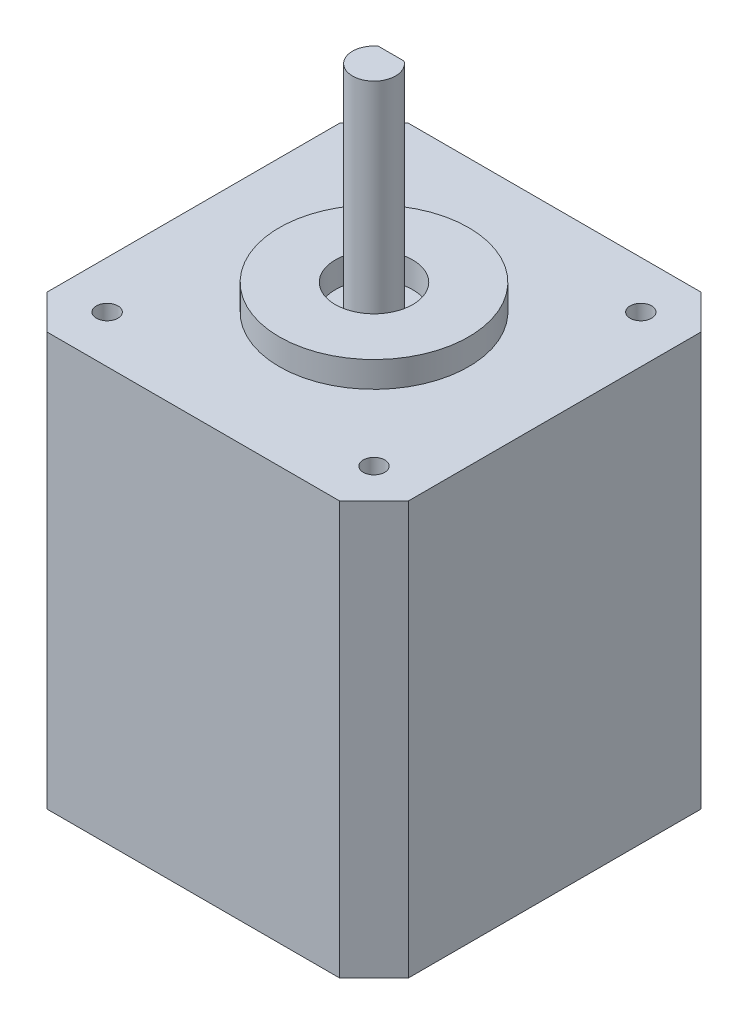
ISO-10303-21;
HEADER;
FILE_DESCRIPTION(('STEP AP214'),'2;1');
FILE_NAME('part.step','',(''),(''),'','','');
FILE_SCHEMA(('AUTOMOTIVE_DESIGN { 1 0 10303 214 1 1 1 1 }'));
ENDSEC;
DATA;
#1=APPLICATION_CONTEXT('core data for automotive mechanical design processes');
#2=APPLICATION_PROTOCOL_DEFINITION('international standard','automotive_design',2000,#1);
#3=PRODUCT_CONTEXT('',#1,'mechanical');
#4=PRODUCT('Part','Part','',(#3));
#5=PRODUCT_RELATED_PRODUCT_CATEGORY('part','',(#4));
#6=PRODUCT_DEFINITION_FORMATION('','',#4);
#7=PRODUCT_DEFINITION_CONTEXT('part definition',#1,'design');
#8=PRODUCT_DEFINITION('design','',#6,#7);
#9=PRODUCT_DEFINITION_SHAPE('','',#8);
#10=(LENGTH_UNIT() NAMED_UNIT(*) SI_UNIT(.MILLI.,.METRE.));
#11=(NAMED_UNIT(*) PLANE_ANGLE_UNIT() SI_UNIT($,.RADIAN.));
#12=(NAMED_UNIT(*) SI_UNIT($,.STERADIAN.) SOLID_ANGLE_UNIT());
#13=UNCERTAINTY_MEASURE_WITH_UNIT(LENGTH_MEASURE(1.E-05),#10,'distance_accuracy_value','');
#14=(GEOMETRIC_REPRESENTATION_CONTEXT(3) GLOBAL_UNCERTAINTY_ASSIGNED_CONTEXT((#13)) GLOBAL_UNIT_ASSIGNED_CONTEXT((#10,
#11,#12)) REPRESENTATION_CONTEXT('',''));
#15=CARTESIAN_POINT('',(0.,0.,0.));
#16=DIRECTION('',(0.,0.,1.));
#17=DIRECTION('',(1.,0.,0.));
#18=AXIS2_PLACEMENT_3D('',#15,#16,#17);
#19=CARTESIAN_POINT('',(0.,48.,0.));
#20=DIRECTION('',(0.,1.,0.));
#21=DIRECTION('',(0.,0.,1.));
#22=AXIS2_PLACEMENT_3D('',#19,#20,#21);
#23=PLANE('',#22);
#24=CARTESIAN_POINT('',(0.,48.,0.));
#25=DIRECTION('',(0.,1.,0.));
#26=DIRECTION('',(0.,0.,1.));
#27=AXIS2_PLACEMENT_3D('',#24,#25,#26);
#28=CIRCLE('',#27,4.5);
#29=CARTESIAN_POINT('',(0.,48.,4.5));
#30=VERTEX_POINT('',#29);
#31=EDGE_CURVE('E194',#30,#30,#28,.F.);
#32=ORIENTED_EDGE('',*,*,#31,.F.);
#33=EDGE_LOOP('',(#32));
#34=FACE_BOUND('',#33,.T.);
#35=DIRECTION('',(-1.,0.,0.));
#36=VECTOR('',#35,1.);
#37=CARTESIAN_POINT('',(1.5,48.,-2.));
#38=LINE('',#37,#36);
#39=CARTESIAN_POINT('',(1.5,48.,-2.));
#40=VERTEX_POINT('',#39);
#41=CARTESIAN_POINT('',(-1.5,48.,-2.));
#42=VERTEX_POINT('',#41);
#43=EDGE_CURVE('E163',#40,#42,#38,.T.);
#44=ORIENTED_EDGE('',*,*,#43,.F.);
#45=CARTESIAN_POINT('',(0.,48.,0.));
#46=DIRECTION('',(0.,1.,0.));
#47=DIRECTION('',(0.,0.,1.));
#48=AXIS2_PLACEMENT_3D('',#45,#46,#47);
#49=CIRCLE('',#48,2.5);
#50=EDGE_CURVE('E158',#42,#40,#49,.T.);
#51=ORIENTED_EDGE('',*,*,#50,.F.);
#52=EDGE_LOOP('',(#44,#51));
#53=FACE_BOUND('',#52,.T.);
#54=ADVANCED_FACE('F37',(#34,#53),#23,.T.);
#55=CARTESIAN_POINT('',(-21.,48.,21.));
#56=DIRECTION('',(1.,0.,0.));
#57=DIRECTION('',(0.,0.,-1.));
#58=AXIS2_PLACEMENT_3D('',#55,#56,#57);
#59=PLANE('',#58);
#60=DIRECTION('',(0.,0.,1.));
#61=VECTOR('',#60,1.);
#62=CARTESIAN_POINT('',(-21.,0.,21.));
#63=LINE('',#62,#61);
#64=CARTESIAN_POINT('',(-21.,0.,-17.));
#65=VERTEX_POINT('',#64);
#66=CARTESIAN_POINT('',(-21.,0.,17.));
#67=VERTEX_POINT('',#66);
#68=EDGE_CURVE('E180',#65,#67,#63,.T.);
#69=ORIENTED_EDGE('',*,*,#68,.T.);
#70=DIRECTION('',(0.,1.,0.));
#71=VECTOR('',#70,1.);
#72=CARTESIAN_POINT('',(-21.,48.,17.));
#73=LINE('',#72,#71);
#74=CARTESIAN_POINT('',(-21.,48.,17.));
#75=VERTEX_POINT('',#74);
#76=EDGE_CURVE('E11',#67,#75,#73,.T.);
#77=ORIENTED_EDGE('',*,*,#76,.T.);
#78=DIRECTION('',(0.,0.,1.));
#79=VECTOR('',#78,1.);
#80=CARTESIAN_POINT('',(-21.,48.,21.));
#81=LINE('',#80,#79);
#82=CARTESIAN_POINT('',(-21.,48.,-17.));
#83=VERTEX_POINT('',#82);
#84=EDGE_CURVE('E183',#83,#75,#81,.T.);
#85=ORIENTED_EDGE('',*,*,#84,.F.);
#86=DIRECTION('',(0.,-1.,0.));
#87=VECTOR('',#86,1.);
#88=CARTESIAN_POINT('',(-21.,48.,-17.));
#89=LINE('',#88,#87);
#90=EDGE_CURVE('E45',#83,#65,#89,.T.);
#91=ORIENTED_EDGE('',*,*,#90,.T.);
#92=EDGE_LOOP('',(#69,#77,#85,#91));
#93=FACE_BOUND('',#92,.T.);
#94=ADVANCED_FACE('F239',(#93),#59,.F.);
#95=CARTESIAN_POINT('',(21.,48.,21.));
#96=DIRECTION('',(0.,0.,-1.));
#97=DIRECTION('',(-1.,0.,0.));
#98=AXIS2_PLACEMENT_3D('',#95,#96,#97);
#99=PLANE('',#98);
#100=DIRECTION('',(1.,0.,0.));
#101=VECTOR('',#100,1.);
#102=CARTESIAN_POINT('',(21.,0.,21.));
#103=LINE('',#102,#101);
#104=CARTESIAN_POINT('',(-17.,0.,21.));
#105=VERTEX_POINT('',#104);
#106=CARTESIAN_POINT('',(17.,0.,21.));
#107=VERTEX_POINT('',#106);
#108=EDGE_CURVE('E197',#105,#107,#103,.T.);
#109=ORIENTED_EDGE('',*,*,#108,.T.);
#110=DIRECTION('',(0.,1.,0.));
#111=VECTOR('',#110,1.);
#112=CARTESIAN_POINT('',(17.,48.,21.));
#113=LINE('',#112,#111);
#114=CARTESIAN_POINT('',(17.,48.,21.));
#115=VERTEX_POINT('',#114);
#116=EDGE_CURVE('E52',#107,#115,#113,.T.);
#117=ORIENTED_EDGE('',*,*,#116,.T.);
#118=DIRECTION('',(1.,0.,0.));
#119=VECTOR('',#118,1.);
#120=CARTESIAN_POINT('',(21.,48.,21.));
#121=LINE('',#120,#119);
#122=CARTESIAN_POINT('',(-17.,48.,21.));
#123=VERTEX_POINT('',#122);
#124=EDGE_CURVE('E185',#123,#115,#121,.T.);
#125=ORIENTED_EDGE('',*,*,#124,.F.);
#126=DIRECTION('',(0.,-1.,0.));
#127=VECTOR('',#126,1.);
#128=CARTESIAN_POINT('',(-17.,48.,21.));
#129=LINE('',#128,#127);
#130=EDGE_CURVE('E231',#123,#105,#129,.T.);
#131=ORIENTED_EDGE('',*,*,#130,.T.);
#132=EDGE_LOOP('',(#109,#117,#125,#131));
#133=FACE_BOUND('',#132,.T.);
#134=ADVANCED_FACE('F250',(#133),#99,.F.);
#135=CARTESIAN_POINT('',(21.,48.,21.));
#136=DIRECTION('',(-1.,0.,0.));
#137=DIRECTION('',(0.,0.,1.));
#138=AXIS2_PLACEMENT_3D('',#135,#136,#137);
#139=PLANE('',#138);
#140=DIRECTION('',(0.,0.,-1.));
#141=VECTOR('',#140,1.);
#142=CARTESIAN_POINT('',(21.,0.,21.));
#143=LINE('',#142,#141);
#144=CARTESIAN_POINT('',(21.,0.,17.));
#145=VERTEX_POINT('',#144);
#146=CARTESIAN_POINT('',(21.,0.,-17.));
#147=VERTEX_POINT('',#146);
#148=EDGE_CURVE('E199',#145,#147,#143,.T.);
#149=ORIENTED_EDGE('',*,*,#148,.T.);
#150=DIRECTION('',(0.,1.,0.));
#151=VECTOR('',#150,1.);
#152=CARTESIAN_POINT('',(21.,48.,-17.));
#153=LINE('',#152,#151);
#154=CARTESIAN_POINT('',(21.,48.,-17.));
#155=VERTEX_POINT('',#154);
#156=EDGE_CURVE('E222',#147,#155,#153,.T.);
#157=ORIENTED_EDGE('',*,*,#156,.T.);
#158=DIRECTION('',(0.,0.,-1.));
#159=VECTOR('',#158,1.);
#160=CARTESIAN_POINT('',(21.,48.,21.));
#161=LINE('',#160,#159);
#162=CARTESIAN_POINT('',(21.,48.,17.));
#163=VERTEX_POINT('',#162);
#164=EDGE_CURVE('E188',#163,#155,#161,.T.);
#165=ORIENTED_EDGE('',*,*,#164,.F.);
#166=DIRECTION('',(0.,-1.,0.));
#167=VECTOR('',#166,1.);
#168=CARTESIAN_POINT('',(21.,48.,17.));
#169=LINE('',#168,#167);
#170=EDGE_CURVE('E219',#163,#145,#169,.T.);
#171=ORIENTED_EDGE('',*,*,#170,.T.);
#172=EDGE_LOOP('',(#149,#157,#165,#171));
#173=FACE_BOUND('',#172,.T.);
#174=ADVANCED_FACE('F259',(#173),#139,.F.);
#175=CARTESIAN_POINT('',(21.,48.,-21.));
#176=DIRECTION('',(0.,0.,1.));
#177=DIRECTION('',(1.,0.,0.));
#178=AXIS2_PLACEMENT_3D('',#175,#176,#177);
#179=PLANE('',#178);
#180=DIRECTION('',(-1.,0.,0.));
#181=VECTOR('',#180,1.);
#182=CARTESIAN_POINT('',(21.,48.,-21.));
#183=LINE('',#182,#181);
#184=CARTESIAN_POINT('',(17.,48.,-21.));
#185=VERTEX_POINT('',#184);
#186=CARTESIAN_POINT('',(-17.,48.,-21.));
#187=VERTEX_POINT('',#186);
#188=EDGE_CURVE('E191',#185,#187,#183,.T.);
#189=ORIENTED_EDGE('',*,*,#188,.F.);
#190=DIRECTION('',(0.,-1.,0.));
#191=VECTOR('',#190,1.);
#192=CARTESIAN_POINT('',(17.,48.,-21.));
#193=LINE('',#192,#191);
#194=CARTESIAN_POINT('',(17.,0.,-21.));
#195=VERTEX_POINT('',#194);
#196=EDGE_CURVE('E208',#185,#195,#193,.T.);
#197=ORIENTED_EDGE('',*,*,#196,.T.);
#198=DIRECTION('',(-1.,0.,0.));
#199=VECTOR('',#198,1.);
#200=CARTESIAN_POINT('',(21.,0.,-21.));
#201=LINE('',#200,#199);
#202=CARTESIAN_POINT('',(-17.,0.,-21.));
#203=VERTEX_POINT('',#202);
#204=EDGE_CURVE('E186',#195,#203,#201,.T.);
#205=ORIENTED_EDGE('',*,*,#204,.T.);
#206=DIRECTION('',(0.,1.,0.));
#207=VECTOR('',#206,1.);
#208=CARTESIAN_POINT('',(-17.,48.,-21.));
#209=LINE('',#208,#207);
#210=EDGE_CURVE('E206',#203,#187,#209,.T.);
#211=ORIENTED_EDGE('',*,*,#210,.T.);
#212=EDGE_LOOP('',(#189,#197,#205,#211));
#213=FACE_BOUND('',#212,.T.);
#214=ADVANCED_FACE('F267',(#213),#179,.F.);
#215=CARTESIAN_POINT('',(-15.5,48.,-15.5));
#216=DIRECTION('',(0.,1.,0.));
#217=DIRECTION('',(0.,0.,1.));
#218=AXIS2_PLACEMENT_3D('',#215,#216,#217);
#219=CIRCLE('',#218,1.24999999999999);
#220=CARTESIAN_POINT('',(-15.5,48.,-14.25));
#221=VERTEX_POINT('',#220);
#222=EDGE_CURVE('E136',#221,#221,#219,.T.);
#223=ORIENTED_EDGE('',*,*,#222,.F.);
#224=EDGE_LOOP('',(#223));
#225=FACE_BOUND('',#224,.T.);
#226=CARTESIAN_POINT('',(-15.5,48.,15.5));
#227=DIRECTION('',(0.,1.,0.));
#228=DIRECTION('',(0.,0.,1.));
#229=AXIS2_PLACEMENT_3D('',#226,#227,#228);
#230=CIRCLE('',#229,1.24999999999999);
#231=CARTESIAN_POINT('',(-15.5,48.,16.75));
#232=VERTEX_POINT('',#231);
#233=EDGE_CURVE('E135',#232,#232,#230,.T.);
#234=ORIENTED_EDGE('',*,*,#233,.F.);
#235=EDGE_LOOP('',(#234));
#236=FACE_BOUND('',#235,.T.);
#237=CARTESIAN_POINT('',(15.5,48.,15.5));
#238=DIRECTION('',(0.,1.,0.));
#239=DIRECTION('',(0.,0.,1.));
#240=AXIS2_PLACEMENT_3D('',#237,#238,#239);
#241=CIRCLE('',#240,1.24999999999999);
#242=CARTESIAN_POINT('',(15.5,48.,16.75));
#243=VERTEX_POINT('',#242);
#244=EDGE_CURVE('E146',#243,#243,#241,.T.);
#245=ORIENTED_EDGE('',*,*,#244,.F.);
#246=EDGE_LOOP('',(#245));
#247=FACE_BOUND('',#246,.T.);
#248=CARTESIAN_POINT('',(15.5,48.,-15.5));
#249=DIRECTION('',(0.,1.,0.));
#250=DIRECTION('',(0.,0.,1.));
#251=AXIS2_PLACEMENT_3D('',#248,#249,#250);
#252=CIRCLE('',#251,1.24999999999999);
#253=CARTESIAN_POINT('',(15.5,48.,-14.25));
#254=VERTEX_POINT('',#253);
#255=EDGE_CURVE('E152',#254,#254,#252,.T.);
#256=ORIENTED_EDGE('',*,*,#255,.F.);
#257=EDGE_LOOP('',(#256));
#258=FACE_BOUND('',#257,.T.);
#259=CARTESIAN_POINT('',(0.,48.,0.));
#260=DIRECTION('',(0.,1.,0.));
#261=DIRECTION('',(0.,0.,1.));
#262=AXIS2_PLACEMENT_3D('',#259,#260,#261);
#263=CIRCLE('',#262,11.);
#264=CARTESIAN_POINT('',(0.,48.,11.));
#265=VERTEX_POINT('',#264);
#266=EDGE_CURVE('E176',#265,#265,#263,.T.);
#267=ORIENTED_EDGE('',*,*,#266,.F.);
#268=EDGE_LOOP('',(#267));
#269=FACE_BOUND('',#268,.T.);
#270=ORIENTED_EDGE('',*,*,#164,.T.);
#271=DIRECTION('',(0.707106781186547,0.,0.707106781186548));
#272=VECTOR('',#271,1.);
#273=CARTESIAN_POINT('',(19.,48.,-19.));
#274=LINE('',#273,#272);
#275=EDGE_CURVE('E229',#155,#185,#274,.F.);
#276=ORIENTED_EDGE('',*,*,#275,.T.);
#277=ORIENTED_EDGE('',*,*,#188,.T.);
#278=DIRECTION('',(0.707106781186548,0.,-0.707106781186547));
#279=VECTOR('',#278,1.);
#280=CARTESIAN_POINT('',(-19.,48.,-19.));
#281=LINE('',#280,#279);
#282=EDGE_CURVE('E224',#187,#83,#281,.F.);
#283=ORIENTED_EDGE('',*,*,#282,.T.);
#284=ORIENTED_EDGE('',*,*,#84,.T.);
#285=DIRECTION('',(-0.707106781186545,0.,-0.70710678118655));
#286=VECTOR('',#285,1.);
#287=CARTESIAN_POINT('',(-19.0000000000001,48.,18.9999999999999));
#288=LINE('',#287,#286);
#289=EDGE_CURVE('E59',#75,#123,#288,.F.);
#290=ORIENTED_EDGE('',*,*,#289,.T.);
#291=ORIENTED_EDGE('',*,*,#124,.T.);
#292=DIRECTION('',(-0.707106781186548,0.,0.707106781186548));
#293=VECTOR('',#292,1.);
#294=CARTESIAN_POINT('',(19.,48.,19.));
#295=LINE('',#294,#293);
#296=EDGE_CURVE('E227',#115,#163,#295,.F.);
#297=ORIENTED_EDGE('',*,*,#296,.T.);
#298=EDGE_LOOP('',(#270,#276,#277,#283,#284,#290,#291,#297));
#299=FACE_BOUND('',#298,.T.);
#300=ADVANCED_FACE('F252',(#225,#236,#247,#258,#269,#299),#23,.T.);
#301=CARTESIAN_POINT('',(0.,0.,0.));
#302=DIRECTION('',(0.,1.,0.));
#303=DIRECTION('',(0.,0.,1.));
#304=AXIS2_PLACEMENT_3D('',#301,#302,#303);
#305=PLANE('',#304);
#306=ORIENTED_EDGE('',*,*,#204,.F.);
#307=DIRECTION('',(-0.707106781186547,0.,-0.707106781186548));
#308=VECTOR('',#307,1.);
#309=CARTESIAN_POINT('',(17.,0.,-21.));
#310=LINE('',#309,#308);
#311=EDGE_CURVE('E217',#195,#147,#310,.F.);
#312=ORIENTED_EDGE('',*,*,#311,.T.);
#313=ORIENTED_EDGE('',*,*,#148,.F.);
#314=DIRECTION('',(0.707106781186548,0.,-0.707106781186548));
#315=VECTOR('',#314,1.);
#316=CARTESIAN_POINT('',(21.,0.,17.));
#317=LINE('',#316,#315);
#318=EDGE_CURVE('E215',#145,#107,#317,.F.);
#319=ORIENTED_EDGE('',*,*,#318,.T.);
#320=ORIENTED_EDGE('',*,*,#108,.F.);
#321=DIRECTION('',(0.707106781186545,0.,0.70710678118655));
#322=VECTOR('',#321,1.);
#323=CARTESIAN_POINT('',(-17.,0.,21.));
#324=LINE('',#323,#322);
#325=EDGE_CURVE('E213',#105,#67,#324,.F.);
#326=ORIENTED_EDGE('',*,*,#325,.T.);
#327=ORIENTED_EDGE('',*,*,#68,.F.);
#328=DIRECTION('',(-0.707106781186548,0.,0.707106781186547));
#329=VECTOR('',#328,1.);
#330=CARTESIAN_POINT('',(-21.,0.,-17.));
#331=LINE('',#330,#329);
#332=EDGE_CURVE('E211',#65,#203,#331,.F.);
#333=ORIENTED_EDGE('',*,*,#332,.T.);
#334=EDGE_LOOP('',(#306,#312,#313,#319,#320,#326,#327,#333));
#335=FACE_BOUND('',#334,.T.);
#336=ADVANCED_FACE('F245',(#335),#305,.F.);
#337=CARTESIAN_POINT('',(0.,51.,0.));
#338=DIRECTION('',(0.,1.,0.));
#339=DIRECTION('',(0.,0.,1.));
#340=AXIS2_PLACEMENT_3D('',#337,#338,#339);
#341=PLANE('',#340);
#342=CARTESIAN_POINT('',(0.,51.,0.));
#343=DIRECTION('',(0.,1.,0.));
#344=DIRECTION('',(0.,0.,1.));
#345=AXIS2_PLACEMENT_3D('',#342,#343,#344);
#346=CIRCLE('',#345,11.);
#347=CARTESIAN_POINT('',(0.,51.,11.));
#348=VERTEX_POINT('',#347);
#349=EDGE_CURVE('E177',#348,#348,#346,.T.);
#350=ORIENTED_EDGE('',*,*,#349,.T.);
#351=EDGE_LOOP('',(#350));
#352=FACE_BOUND('',#351,.T.);
#353=CARTESIAN_POINT('',(0.,51.,0.));
#354=DIRECTION('',(0.,1.,0.));
#355=DIRECTION('',(0.,0.,1.));
#356=AXIS2_PLACEMENT_3D('',#353,#354,#355);
#357=CIRCLE('',#356,4.5);
#358=CARTESIAN_POINT('',(0.,51.,4.5));
#359=VERTEX_POINT('',#358);
#360=EDGE_CURVE('E173',#359,#359,#357,.T.);
#361=ORIENTED_EDGE('',*,*,#360,.F.);
#362=EDGE_LOOP('',(#361));
#363=FACE_BOUND('',#362,.T.);
#364=ADVANCED_FACE('F290',(#352,#363),#341,.T.);
#365=CARTESIAN_POINT('',(0.,51.,0.));
#366=DIRECTION('',(0.,-1.,0.));
#367=DIRECTION('',(0.,0.,-1.));
#368=AXIS2_PLACEMENT_3D('',#365,#366,#367);
#369=CYLINDRICAL_SURFACE('',#368,11.);
#370=ORIENTED_EDGE('',*,*,#349,.F.);
#371=EDGE_LOOP('',(#370));
#372=FACE_BOUND('',#371,.T.);
#373=ORIENTED_EDGE('',*,*,#266,.T.);
#374=EDGE_LOOP('',(#373));
#375=FACE_BOUND('',#374,.T.);
#376=ADVANCED_FACE('F302',(#372,#375),#369,.T.);
#377=CARTESIAN_POINT('',(0.,51.,0.));
#378=DIRECTION('',(0.,-1.,0.));
#379=DIRECTION('',(0.,0.,-1.));
#380=AXIS2_PLACEMENT_3D('',#377,#378,#379);
#381=CYLINDRICAL_SURFACE('',#380,4.5);
#382=ORIENTED_EDGE('',*,*,#360,.T.);
#383=EDGE_LOOP('',(#382));
#384=FACE_BOUND('',#383,.T.);
#385=ORIENTED_EDGE('',*,*,#31,.T.);
#386=EDGE_LOOP('',(#385));
#387=FACE_BOUND('',#386,.T.);
#388=ADVANCED_FACE('F304',(#384,#387),#381,.F.);
#389=CARTESIAN_POINT('',(0.,73.,0.));
#390=DIRECTION('',(0.,-1.,0.));
#391=DIRECTION('',(0.,0.,-1.));
#392=AXIS2_PLACEMENT_3D('',#389,#390,#391);
#393=CYLINDRICAL_SURFACE('',#392,2.5);
#394=ORIENTED_EDGE('',*,*,#50,.T.);
#395=DIRECTION('',(0.,-1.,0.));
#396=VECTOR('',#395,1.);
#397=CARTESIAN_POINT('',(1.5,73.,-2.));
#398=LINE('',#397,#396);
#399=CARTESIAN_POINT('',(1.5,73.,-2.));
#400=VERTEX_POINT('',#399);
#401=EDGE_CURVE('E170',#400,#40,#398,.T.);
#402=ORIENTED_EDGE('',*,*,#401,.F.);
#403=CARTESIAN_POINT('',(0.,73.,0.));
#404=DIRECTION('',(0.,1.,0.));
#405=DIRECTION('',(0.,0.,1.));
#406=AXIS2_PLACEMENT_3D('',#403,#404,#405);
#407=CIRCLE('',#406,2.5);
#408=CARTESIAN_POINT('',(-1.5,73.,-2.));
#409=VERTEX_POINT('',#408);
#410=EDGE_CURVE('E159',#409,#400,#407,.T.);
#411=ORIENTED_EDGE('',*,*,#410,.F.);
#412=DIRECTION('',(0.,-1.,0.));
#413=VECTOR('',#412,1.);
#414=CARTESIAN_POINT('',(-1.5,73.,-2.));
#415=LINE('',#414,#413);
#416=EDGE_CURVE('E165',#409,#42,#415,.T.);
#417=ORIENTED_EDGE('',*,*,#416,.T.);
#418=EDGE_LOOP('',(#394,#402,#411,#417));
#419=FACE_BOUND('',#418,.T.);
#420=ADVANCED_FACE('F310',(#419),#393,.T.);
#421=CARTESIAN_POINT('',(1.5,73.,-2.));
#422=DIRECTION('',(0.,0.,1.));
#423=DIRECTION('',(1.,0.,0.));
#424=AXIS2_PLACEMENT_3D('',#421,#422,#423);
#425=PLANE('',#424);
#426=ORIENTED_EDGE('',*,*,#43,.T.);
#427=ORIENTED_EDGE('',*,*,#416,.F.);
#428=DIRECTION('',(-1.,0.,0.));
#429=VECTOR('',#428,1.);
#430=CARTESIAN_POINT('',(1.5,73.,-2.));
#431=LINE('',#430,#429);
#432=EDGE_CURVE('E162',#400,#409,#431,.T.);
#433=ORIENTED_EDGE('',*,*,#432,.F.);
#434=ORIENTED_EDGE('',*,*,#401,.T.);
#435=EDGE_LOOP('',(#426,#427,#433,#434));
#436=FACE_BOUND('',#435,.T.);
#437=ADVANCED_FACE('F319',(#436),#425,.F.);
#438=CARTESIAN_POINT('',(0.,73.,0.));
#439=DIRECTION('',(0.,1.,0.));
#440=DIRECTION('',(0.,0.,1.));
#441=AXIS2_PLACEMENT_3D('',#438,#439,#440);
#442=PLANE('',#441);
#443=ORIENTED_EDGE('',*,*,#410,.T.);
#444=ORIENTED_EDGE('',*,*,#432,.T.);
#445=EDGE_LOOP('',(#443,#444));
#446=FACE_BOUND('',#445,.T.);
#447=ADVANCED_FACE('F323',(#446),#442,.T.);
#448=CARTESIAN_POINT('',(15.5,39.5,-15.5));
#449=DIRECTION('',(0.,1.,0.));
#450=DIRECTION('',(0.,0.,1.));
#451=AXIS2_PLACEMENT_3D('',#448,#449,#450);
#452=CONICAL_SURFACE('',#451,1.24999999999999,1.02974425867665);
#453=CARTESIAN_POINT('',(15.5,38.7489242262155,-15.5));
#454=VERTEX_POINT('',#453);
#455=VERTEX_LOOP('',#454);
#456=FACE_BOUND('',#455,.T.);
#457=CARTESIAN_POINT('',(15.5,39.5,-15.5));
#458=DIRECTION('',(0.,1.,0.));
#459=DIRECTION('',(0.,0.,1.));
#460=AXIS2_PLACEMENT_3D('',#457,#458,#459);
#461=CIRCLE('',#460,1.24999999999999);
#462=CARTESIAN_POINT('',(15.5,39.5,-14.25));
#463=VERTEX_POINT('',#462);
#464=EDGE_CURVE('E155',#463,#463,#461,.T.);
#465=ORIENTED_EDGE('',*,*,#464,.T.);
#466=EDGE_LOOP('',(#465));
#467=FACE_BOUND('',#466,.T.);
#468=ADVANCED_FACE('F327',(#456,#467),#452,.F.);
#469=CARTESIAN_POINT('',(15.5,48.,-15.5));
#470=DIRECTION('',(0.,1.,0.));
#471=DIRECTION('',(0.,0.,1.));
#472=AXIS2_PLACEMENT_3D('',#469,#470,#471);
#473=CYLINDRICAL_SURFACE('',#472,1.24999999999999);
#474=ORIENTED_EDGE('',*,*,#464,.F.);
#475=EDGE_LOOP('',(#474));
#476=FACE_BOUND('',#475,.T.);
#477=ORIENTED_EDGE('',*,*,#255,.T.);
#478=EDGE_LOOP('',(#477));
#479=FACE_BOUND('',#478,.T.);
#480=ADVANCED_FACE('F331',(#476,#479),#473,.F.);
#481=CARTESIAN_POINT('',(15.5,39.5,15.5));
#482=DIRECTION('',(0.,1.,0.));
#483=DIRECTION('',(0.,0.,1.));
#484=AXIS2_PLACEMENT_3D('',#481,#482,#483);
#485=CONICAL_SURFACE('',#484,1.24999999999999,1.02974425867665);
#486=CARTESIAN_POINT('',(15.5,38.7489242262155,15.5));
#487=VERTEX_POINT('',#486);
#488=VERTEX_LOOP('',#487);
#489=FACE_BOUND('',#488,.T.);
#490=CARTESIAN_POINT('',(15.5,39.5,15.5));
#491=DIRECTION('',(0.,1.,0.));
#492=DIRECTION('',(0.,0.,1.));
#493=AXIS2_PLACEMENT_3D('',#490,#491,#492);
#494=CIRCLE('',#493,1.24999999999999);
#495=CARTESIAN_POINT('',(15.5,39.5,16.75));
#496=VERTEX_POINT('',#495);
#497=EDGE_CURVE('E149',#496,#496,#494,.T.);
#498=ORIENTED_EDGE('',*,*,#497,.T.);
#499=EDGE_LOOP('',(#498));
#500=FACE_BOUND('',#499,.T.);
#501=ADVANCED_FACE('F335',(#489,#500),#485,.F.);
#502=CARTESIAN_POINT('',(15.5,48.,15.5));
#503=DIRECTION('',(0.,1.,0.));
#504=DIRECTION('',(0.,0.,1.));
#505=AXIS2_PLACEMENT_3D('',#502,#503,#504);
#506=CYLINDRICAL_SURFACE('',#505,1.24999999999999);
#507=ORIENTED_EDGE('',*,*,#497,.F.);
#508=EDGE_LOOP('',(#507));
#509=FACE_BOUND('',#508,.T.);
#510=ORIENTED_EDGE('',*,*,#244,.T.);
#511=EDGE_LOOP('',(#510));
#512=FACE_BOUND('',#511,.T.);
#513=ADVANCED_FACE('F339',(#509,#512),#506,.F.);
#514=CARTESIAN_POINT('',(-15.5,39.5,15.5));
#515=DIRECTION('',(0.,1.,0.));
#516=DIRECTION('',(0.,0.,1.));
#517=AXIS2_PLACEMENT_3D('',#514,#515,#516);
#518=CONICAL_SURFACE('',#517,1.24999999999999,1.02974425867665);
#519=CARTESIAN_POINT('',(-15.5,38.7489242262155,15.5));
#520=VERTEX_POINT('',#519);
#521=VERTEX_LOOP('',#520);
#522=FACE_BOUND('',#521,.T.);
#523=CARTESIAN_POINT('',(-15.5,39.5,15.5));
#524=DIRECTION('',(0.,1.,0.));
#525=DIRECTION('',(0.,0.,1.));
#526=AXIS2_PLACEMENT_3D('',#523,#524,#525);
#527=CIRCLE('',#526,1.24999999999999);
#528=CARTESIAN_POINT('',(-15.5,39.5,16.75));
#529=VERTEX_POINT('',#528);
#530=EDGE_CURVE('E139',#529,#529,#527,.T.);
#531=ORIENTED_EDGE('',*,*,#530,.T.);
#532=EDGE_LOOP('',(#531));
#533=FACE_BOUND('',#532,.T.);
#534=ADVANCED_FACE('F343',(#522,#533),#518,.F.);
#535=CARTESIAN_POINT('',(-15.5,48.,15.5));
#536=DIRECTION('',(0.,1.,0.));
#537=DIRECTION('',(0.,0.,1.));
#538=AXIS2_PLACEMENT_3D('',#535,#536,#537);
#539=CYLINDRICAL_SURFACE('',#538,1.24999999999999);
#540=ORIENTED_EDGE('',*,*,#530,.F.);
#541=EDGE_LOOP('',(#540));
#542=FACE_BOUND('',#541,.T.);
#543=ORIENTED_EDGE('',*,*,#233,.T.);
#544=EDGE_LOOP('',(#543));
#545=FACE_BOUND('',#544,.T.);
#546=ADVANCED_FACE('F129',(#542,#545),#539,.F.);
#547=CARTESIAN_POINT('',(-15.5,39.5,-15.5));
#548=DIRECTION('',(0.,1.,0.));
#549=DIRECTION('',(0.,0.,1.));
#550=AXIS2_PLACEMENT_3D('',#547,#548,#549);
#551=CONICAL_SURFACE('',#550,1.24999999999999,1.02974425867665);
#552=CARTESIAN_POINT('',(-15.5,38.7489242262155,-15.5));
#553=VERTEX_POINT('',#552);
#554=VERTEX_LOOP('',#553);
#555=FACE_BOUND('',#554,.T.);
#556=CARTESIAN_POINT('',(-15.5,39.5,-15.5));
#557=DIRECTION('',(0.,1.,0.));
#558=DIRECTION('',(0.,0.,1.));
#559=AXIS2_PLACEMENT_3D('',#556,#557,#558);
#560=CIRCLE('',#559,1.24999999999999);
#561=CARTESIAN_POINT('',(-15.5,39.5,-14.25));
#562=VERTEX_POINT('',#561);
#563=EDGE_CURVE('E133',#562,#562,#560,.T.);
#564=ORIENTED_EDGE('',*,*,#563,.T.);
#565=EDGE_LOOP('',(#564));
#566=FACE_BOUND('',#565,.T.);
#567=ADVANCED_FACE('F125',(#555,#566),#551,.F.);
#568=CARTESIAN_POINT('',(-15.5,48.,-15.5));
#569=DIRECTION('',(0.,1.,0.));
#570=DIRECTION('',(0.,0.,1.));
#571=AXIS2_PLACEMENT_3D('',#568,#569,#570);
#572=CYLINDRICAL_SURFACE('',#571,1.24999999999999);
#573=ORIENTED_EDGE('',*,*,#563,.F.);
#574=EDGE_LOOP('',(#573));
#575=FACE_BOUND('',#574,.T.);
#576=ORIENTED_EDGE('',*,*,#222,.T.);
#577=EDGE_LOOP('',(#576));
#578=FACE_BOUND('',#577,.T.);
#579=ADVANCED_FACE('F128',(#575,#578),#572,.F.);
#580=CARTESIAN_POINT('',(17.,48.,-21.));
#581=DIRECTION('',(-0.707106781186548,0.,0.707106781186547));
#582=DIRECTION('',(0.,-1.,0.));
#583=AXIS2_PLACEMENT_3D('',#580,#581,#582);
#584=PLANE('',#583);
#585=ORIENTED_EDGE('',*,*,#275,.F.);
#586=ORIENTED_EDGE('',*,*,#156,.F.);
#587=ORIENTED_EDGE('',*,*,#311,.F.);
#588=ORIENTED_EDGE('',*,*,#196,.F.);
#589=EDGE_LOOP('',(#585,#586,#587,#588));
#590=FACE_BOUND('',#589,.T.);
#591=ADVANCED_FACE('F264',(#590),#584,.F.);
#592=CARTESIAN_POINT('',(21.,48.,17.));
#593=DIRECTION('',(-0.707106781186547,0.,-0.707106781186547));
#594=DIRECTION('',(0.,-1.,0.));
#595=AXIS2_PLACEMENT_3D('',#592,#593,#594);
#596=PLANE('',#595);
#597=ORIENTED_EDGE('',*,*,#296,.F.);
#598=ORIENTED_EDGE('',*,*,#116,.F.);
#599=ORIENTED_EDGE('',*,*,#318,.F.);
#600=ORIENTED_EDGE('',*,*,#170,.F.);
#601=EDGE_LOOP('',(#597,#598,#599,#600));
#602=FACE_BOUND('',#601,.T.);
#603=ADVANCED_FACE('F256',(#602),#596,.F.);
#604=CARTESIAN_POINT('',(-17.,48.,21.));
#605=DIRECTION('',(0.70710678118655,0.,-0.707106781186545));
#606=DIRECTION('',(0.,-1.,0.));
#607=AXIS2_PLACEMENT_3D('',#604,#605,#606);
#608=PLANE('',#607);
#609=ORIENTED_EDGE('',*,*,#289,.F.);
#610=ORIENTED_EDGE('',*,*,#76,.F.);
#611=ORIENTED_EDGE('',*,*,#325,.F.);
#612=ORIENTED_EDGE('',*,*,#130,.F.);
#613=EDGE_LOOP('',(#609,#610,#611,#612));
#614=FACE_BOUND('',#613,.T.);
#615=ADVANCED_FACE('F249',(#614),#608,.F.);
#616=CARTESIAN_POINT('',(-21.,48.,-17.));
#617=DIRECTION('',(0.707106781186547,0.,0.707106781186548));
#618=DIRECTION('',(0.,-1.,0.));
#619=AXIS2_PLACEMENT_3D('',#616,#617,#618);
#620=PLANE('',#619);
#621=ORIENTED_EDGE('',*,*,#282,.F.);
#622=ORIENTED_EDGE('',*,*,#210,.F.);
#623=ORIENTED_EDGE('',*,*,#332,.F.);
#624=ORIENTED_EDGE('',*,*,#90,.F.);
#625=EDGE_LOOP('',(#621,#622,#623,#624));
#626=FACE_BOUND('',#625,.T.);
#627=ADVANCED_FACE('F39',(#626),#620,.F.);
#628=CLOSED_SHELL('',(#54,#94,#134,#174,#214,#300,#336,#364,#376,#388,#420,#437,#447,#468,#480,
#501,#513,#534,#546,#567,#579,#591,#603,#615,#627));
#629=MANIFOLD_SOLID_BREP('B2',#628);
#630=ADVANCED_BREP_SHAPE_REPRESENTATION('',(#18,#629),#14);
#631=SHAPE_DEFINITION_REPRESENTATION(#9,#630);
ENDSEC;
END-ISO-10303-21;
